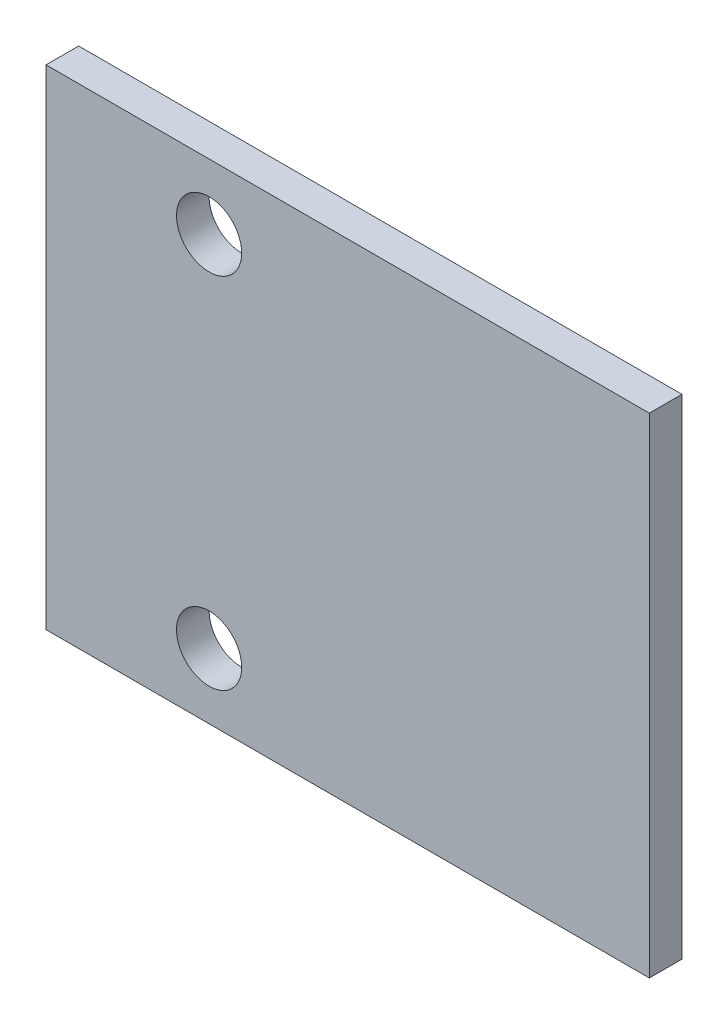
ISO-10303-21;
HEADER;
FILE_DESCRIPTION(('STEP AP214'),'2;1');
FILE_NAME('part.step','',(''),(''),'','','');
FILE_SCHEMA(('AUTOMOTIVE_DESIGN { 1 0 10303 214 1 1 1 1 }'));
ENDSEC;
DATA;
#1=APPLICATION_CONTEXT('core data for automotive mechanical design processes');
#2=APPLICATION_PROTOCOL_DEFINITION('international standard','automotive_design',2000,#1);
#3=PRODUCT_CONTEXT('',#1,'mechanical');
#4=PRODUCT('Part','Part','',(#3));
#5=PRODUCT_RELATED_PRODUCT_CATEGORY('part','',(#4));
#6=PRODUCT_DEFINITION_FORMATION('','',#4);
#7=PRODUCT_DEFINITION_CONTEXT('part definition',#1,'design');
#8=PRODUCT_DEFINITION('design','',#6,#7);
#9=PRODUCT_DEFINITION_SHAPE('','',#8);
#10=(LENGTH_UNIT() NAMED_UNIT(*) SI_UNIT(.MILLI.,.METRE.));
#11=(NAMED_UNIT(*) PLANE_ANGLE_UNIT() SI_UNIT($,.RADIAN.));
#12=(NAMED_UNIT(*) SI_UNIT($,.STERADIAN.) SOLID_ANGLE_UNIT());
#13=UNCERTAINTY_MEASURE_WITH_UNIT(LENGTH_MEASURE(1.E-05),#10,'distance_accuracy_value','');
#14=(GEOMETRIC_REPRESENTATION_CONTEXT(3) GLOBAL_UNCERTAINTY_ASSIGNED_CONTEXT((#13)) GLOBAL_UNIT_ASSIGNED_CONTEXT((#10,
#11,#12)) REPRESENTATION_CONTEXT('',''));
#15=CARTESIAN_POINT('',(0.,0.,0.));
#16=DIRECTION('',(0.,0.,1.));
#17=DIRECTION('',(1.,0.,0.));
#18=AXIS2_PLACEMENT_3D('',#15,#16,#17);
#19=CARTESIAN_POINT('',(0.,0.,1.));
#20=DIRECTION('',(0.,0.,1.));
#21=DIRECTION('',(1.,0.,0.));
#22=AXIS2_PLACEMENT_3D('',#19,#20,#21);
#23=PLANE('',#22);
#24=CARTESIAN_POINT('',(-4.25,5.5,1.));
#25=DIRECTION('',(0.,0.,1.));
#26=DIRECTION('',(1.,0.,0.));
#27=AXIS2_PLACEMENT_3D('',#24,#25,#26);
#28=CIRCLE('',#27,1.);
#29=CARTESIAN_POINT('',(-3.25,5.5,1.));
#30=VERTEX_POINT('',#29);
#31=EDGE_CURVE('E102',#30,#30,#28,.T.);
#32=ORIENTED_EDGE('',*,*,#31,.F.);
#33=EDGE_LOOP('',(#32));
#34=FACE_BOUND('',#33,.T.);
#35=DIRECTION('',(0.,1.,0.));
#36=VECTOR('',#35,1.);
#37=CARTESIAN_POINT('',(9.25,7.5,1.));
#38=LINE('',#37,#36);
#39=CARTESIAN_POINT('',(9.25,-7.5,1.));
#40=VERTEX_POINT('',#39);
#41=CARTESIAN_POINT('',(9.25,7.5,1.));
#42=VERTEX_POINT('',#41);
#43=EDGE_CURVE('E87',#40,#42,#38,.T.);
#44=ORIENTED_EDGE('',*,*,#43,.T.);
#45=DIRECTION('',(-1.,0.,0.));
#46=VECTOR('',#45,1.);
#47=CARTESIAN_POINT('',(-9.25,7.5,1.));
#48=LINE('',#47,#46);
#49=CARTESIAN_POINT('',(-9.25,7.5,1.));
#50=VERTEX_POINT('',#49);
#51=EDGE_CURVE('E82',#42,#50,#48,.T.);
#52=ORIENTED_EDGE('',*,*,#51,.T.);
#53=DIRECTION('',(0.,-1.,0.));
#54=VECTOR('',#53,1.);
#55=CARTESIAN_POINT('',(-9.25,7.5,1.));
#56=LINE('',#55,#54);
#57=CARTESIAN_POINT('',(-9.25,-7.5,1.));
#58=VERTEX_POINT('',#57);
#59=EDGE_CURVE('E85',#50,#58,#56,.T.);
#60=ORIENTED_EDGE('',*,*,#59,.T.);
#61=DIRECTION('',(1.,0.,0.));
#62=VECTOR('',#61,1.);
#63=CARTESIAN_POINT('',(-9.25,-7.5,1.));
#64=LINE('',#63,#62);
#65=EDGE_CURVE('E52',#58,#40,#64,.T.);
#66=ORIENTED_EDGE('',*,*,#65,.T.);
#67=EDGE_LOOP('',(#44,#52,#60,#66));
#68=FACE_BOUND('',#67,.T.);
#69=CARTESIAN_POINT('',(-4.25,-5.5,1.));
#70=DIRECTION('',(0.,0.,1.));
#71=DIRECTION('',(1.,0.,0.));
#72=AXIS2_PLACEMENT_3D('',#69,#70,#71);
#73=CIRCLE('',#72,1.);
#74=CARTESIAN_POINT('',(-3.25,-5.5,1.));
#75=VERTEX_POINT('',#74);
#76=EDGE_CURVE('E117',#75,#75,#73,.T.);
#77=ORIENTED_EDGE('',*,*,#76,.F.);
#78=EDGE_LOOP('',(#77));
#79=FACE_BOUND('',#78,.T.);
#80=ADVANCED_FACE('F35',(#34,#68,#79),#23,.T.);
#81=CARTESIAN_POINT('',(0.,0.,0.));
#82=DIRECTION('',(0.,0.,1.));
#83=DIRECTION('',(1.,0.,0.));
#84=AXIS2_PLACEMENT_3D('',#81,#82,#83);
#85=PLANE('',#84);
#86=DIRECTION('',(0.,1.,0.));
#87=VECTOR('',#86,1.);
#88=CARTESIAN_POINT('',(9.25,7.5,0.));
#89=LINE('',#88,#87);
#90=CARTESIAN_POINT('',(9.25,-7.5,0.));
#91=VERTEX_POINT('',#90);
#92=CARTESIAN_POINT('',(9.25,7.5,0.));
#93=VERTEX_POINT('',#92);
#94=EDGE_CURVE('E99',#91,#93,#89,.T.);
#95=ORIENTED_EDGE('',*,*,#94,.F.);
#96=DIRECTION('',(1.,0.,0.));
#97=VECTOR('',#96,1.);
#98=CARTESIAN_POINT('',(-9.25,-7.5,0.));
#99=LINE('',#98,#97);
#100=CARTESIAN_POINT('',(-9.25,-7.5,0.));
#101=VERTEX_POINT('',#100);
#102=EDGE_CURVE('E75',#101,#91,#99,.T.);
#103=ORIENTED_EDGE('',*,*,#102,.F.);
#104=DIRECTION('',(0.,-1.,0.));
#105=VECTOR('',#104,1.);
#106=CARTESIAN_POINT('',(-9.25,7.5,0.));
#107=LINE('',#106,#105);
#108=CARTESIAN_POINT('',(-9.25,7.5,0.));
#109=VERTEX_POINT('',#108);
#110=EDGE_CURVE('E69',#109,#101,#107,.T.);
#111=ORIENTED_EDGE('',*,*,#110,.F.);
#112=DIRECTION('',(-1.,0.,0.));
#113=VECTOR('',#112,1.);
#114=CARTESIAN_POINT('',(-9.25,7.5,0.));
#115=LINE('',#114,#113);
#116=EDGE_CURVE('E91',#93,#109,#115,.T.);
#117=ORIENTED_EDGE('',*,*,#116,.F.);
#118=EDGE_LOOP('',(#95,#103,#111,#117));
#119=FACE_BOUND('',#118,.T.);
#120=CARTESIAN_POINT('',(-4.25,5.5,0.));
#121=DIRECTION('',(0.,0.,1.));
#122=DIRECTION('',(1.,0.,0.));
#123=AXIS2_PLACEMENT_3D('',#120,#121,#122);
#124=CIRCLE('',#123,1.);
#125=CARTESIAN_POINT('',(-3.25,5.5,0.));
#126=VERTEX_POINT('',#125);
#127=EDGE_CURVE('E114',#126,#126,#124,.T.);
#128=ORIENTED_EDGE('',*,*,#127,.T.);
#129=EDGE_LOOP('',(#128));
#130=FACE_BOUND('',#129,.T.);
#131=CARTESIAN_POINT('',(-4.25,-5.5,0.));
#132=DIRECTION('',(0.,0.,1.));
#133=DIRECTION('',(1.,0.,0.));
#134=AXIS2_PLACEMENT_3D('',#131,#132,#133);
#135=CIRCLE('',#134,1.);
#136=CARTESIAN_POINT('',(-3.25,-5.5,0.));
#137=VERTEX_POINT('',#136);
#138=EDGE_CURVE('E120',#137,#137,#135,.T.);
#139=ORIENTED_EDGE('',*,*,#138,.T.);
#140=EDGE_LOOP('',(#139));
#141=FACE_BOUND('',#140,.T.);
#142=ADVANCED_FACE('F110',(#119,#130,#141),#85,.F.);
#143=CARTESIAN_POINT('',(9.25,7.5,1.));
#144=DIRECTION('',(-1.,0.,0.));
#145=DIRECTION('',(0.,0.,1.));
#146=AXIS2_PLACEMENT_3D('',#143,#144,#145);
#147=PLANE('',#146);
#148=ORIENTED_EDGE('',*,*,#94,.T.);
#149=DIRECTION('',(0.,0.,-1.));
#150=VECTOR('',#149,1.);
#151=CARTESIAN_POINT('',(9.25,7.5,1.));
#152=LINE('',#151,#150);
#153=EDGE_CURVE('E11',#42,#93,#152,.T.);
#154=ORIENTED_EDGE('',*,*,#153,.F.);
#155=ORIENTED_EDGE('',*,*,#43,.F.);
#156=DIRECTION('',(0.,0.,-1.));
#157=VECTOR('',#156,1.);
#158=CARTESIAN_POINT('',(9.25,-7.5,1.));
#159=LINE('',#158,#157);
#160=EDGE_CURVE('E95',#40,#91,#159,.T.);
#161=ORIENTED_EDGE('',*,*,#160,.T.);
#162=EDGE_LOOP('',(#148,#154,#155,#161));
#163=FACE_BOUND('',#162,.T.);
#164=ADVANCED_FACE('F37',(#163),#147,.F.);
#165=CARTESIAN_POINT('',(-9.25,7.5,1.));
#166=DIRECTION('',(0.,-1.,0.));
#167=DIRECTION('',(0.,0.,-1.));
#168=AXIS2_PLACEMENT_3D('',#165,#166,#167);
#169=PLANE('',#168);
#170=ORIENTED_EDGE('',*,*,#116,.T.);
#171=DIRECTION('',(0.,0.,-1.));
#172=VECTOR('',#171,1.);
#173=CARTESIAN_POINT('',(-9.25,7.5,1.));
#174=LINE('',#173,#172);
#175=EDGE_CURVE('E44',#50,#109,#174,.T.);
#176=ORIENTED_EDGE('',*,*,#175,.F.);
#177=ORIENTED_EDGE('',*,*,#51,.F.);
#178=ORIENTED_EDGE('',*,*,#153,.T.);
#179=EDGE_LOOP('',(#170,#176,#177,#178));
#180=FACE_BOUND('',#179,.T.);
#181=ADVANCED_FACE('F90',(#180),#169,.F.);
#182=CARTESIAN_POINT('',(-9.25,7.5,1.));
#183=DIRECTION('',(1.,0.,0.));
#184=DIRECTION('',(0.,0.,-1.));
#185=AXIS2_PLACEMENT_3D('',#182,#183,#184);
#186=PLANE('',#185);
#187=ORIENTED_EDGE('',*,*,#110,.T.);
#188=DIRECTION('',(0.,0.,-1.));
#189=VECTOR('',#188,1.);
#190=CARTESIAN_POINT('',(-9.25,-7.5,1.));
#191=LINE('',#190,#189);
#192=EDGE_CURVE('E92',#58,#101,#191,.T.);
#193=ORIENTED_EDGE('',*,*,#192,.F.);
#194=ORIENTED_EDGE('',*,*,#59,.F.);
#195=ORIENTED_EDGE('',*,*,#175,.T.);
#196=EDGE_LOOP('',(#187,#193,#194,#195));
#197=FACE_BOUND('',#196,.T.);
#198=ADVANCED_FACE('F93',(#197),#186,.F.);
#199=CARTESIAN_POINT('',(-9.25,-7.5,1.));
#200=DIRECTION('',(0.,1.,0.));
#201=DIRECTION('',(0.,0.,1.));
#202=AXIS2_PLACEMENT_3D('',#199,#200,#201);
#203=PLANE('',#202);
#204=ORIENTED_EDGE('',*,*,#102,.T.);
#205=ORIENTED_EDGE('',*,*,#160,.F.);
#206=ORIENTED_EDGE('',*,*,#65,.F.);
#207=ORIENTED_EDGE('',*,*,#192,.T.);
#208=EDGE_LOOP('',(#204,#205,#206,#207));
#209=FACE_BOUND('',#208,.T.);
#210=ADVANCED_FACE('F107',(#209),#203,.F.);
#211=CARTESIAN_POINT('',(-4.25,5.5,1.));
#212=DIRECTION('',(0.,0.,-1.));
#213=DIRECTION('',(-1.,0.,0.));
#214=AXIS2_PLACEMENT_3D('',#211,#212,#213);
#215=CYLINDRICAL_SURFACE('',#214,1.);
#216=ORIENTED_EDGE('',*,*,#31,.T.);
#217=EDGE_LOOP('',(#216));
#218=FACE_BOUND('',#217,.T.);
#219=ORIENTED_EDGE('',*,*,#127,.F.);
#220=EDGE_LOOP('',(#219));
#221=FACE_BOUND('',#220,.T.);
#222=ADVANCED_FACE('F137',(#218,#221),#215,.F.);
#223=CARTESIAN_POINT('',(-4.25,-5.5,1.));
#224=DIRECTION('',(0.,0.,-1.));
#225=DIRECTION('',(-1.,0.,0.));
#226=AXIS2_PLACEMENT_3D('',#223,#224,#225);
#227=CYLINDRICAL_SURFACE('',#226,1.);
#228=ORIENTED_EDGE('',*,*,#76,.T.);
#229=EDGE_LOOP('',(#228));
#230=FACE_BOUND('',#229,.T.);
#231=ORIENTED_EDGE('',*,*,#138,.F.);
#232=EDGE_LOOP('',(#231));
#233=FACE_BOUND('',#232,.T.);
#234=ADVANCED_FACE('F126',(#230,#233),#227,.F.);
#235=CLOSED_SHELL('',(#80,#142,#164,#181,#198,#210,#222,#234));
#236=MANIFOLD_SOLID_BREP('B2',#235);
#237=ADVANCED_BREP_SHAPE_REPRESENTATION('',(#18,#236),#14);
#238=SHAPE_DEFINITION_REPRESENTATION(#9,#237);
ENDSEC;
END-ISO-10303-21;
